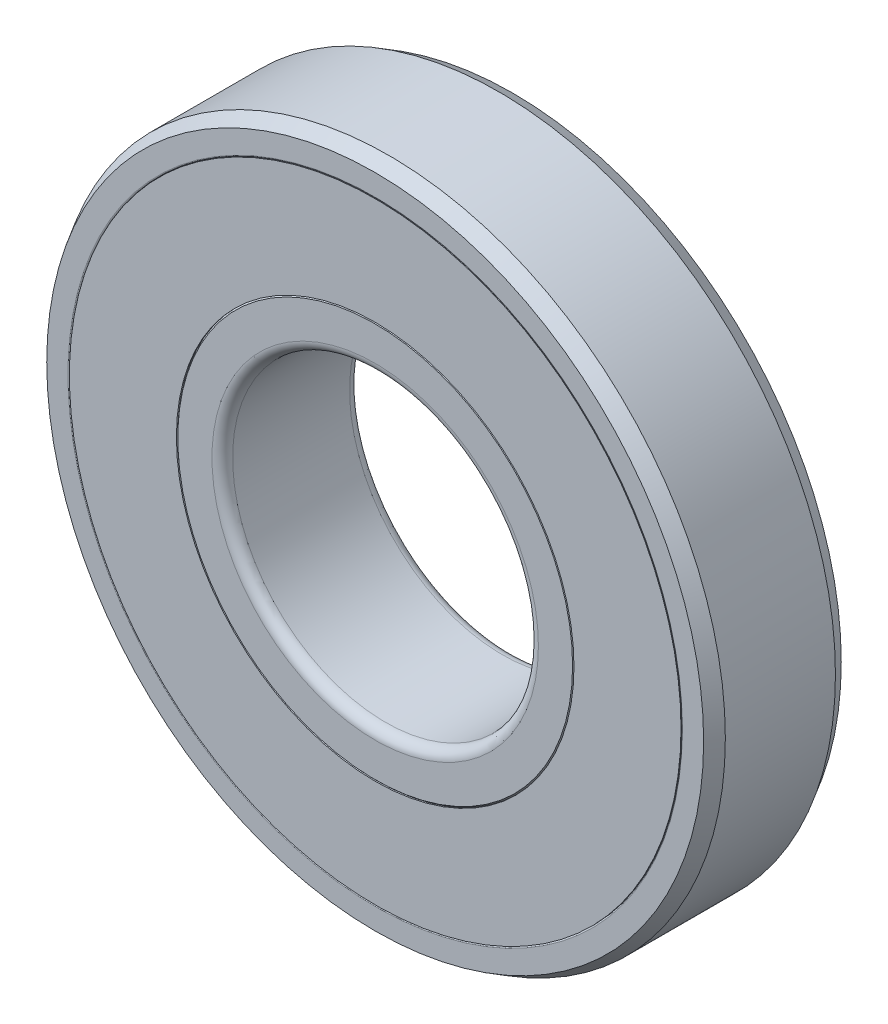
ISO-10303-21;
HEADER;
FILE_DESCRIPTION(('STEP AP214'),'2;1');
FILE_NAME('part.step','',(''),(''),'','','');
FILE_SCHEMA(('AUTOMOTIVE_DESIGN { 1 0 10303 214 1 1 1 1 }'));
ENDSEC;
DATA;
#1=APPLICATION_CONTEXT('core data for automotive mechanical design processes');
#2=APPLICATION_PROTOCOL_DEFINITION('international standard','automotive_design',2000,#1);
#3=PRODUCT_CONTEXT('',#1,'mechanical');
#4=PRODUCT('Part','Part','',(#3));
#5=PRODUCT_RELATED_PRODUCT_CATEGORY('part','',(#4));
#6=PRODUCT_DEFINITION_FORMATION('','',#4);
#7=PRODUCT_DEFINITION_CONTEXT('part definition',#1,'design');
#8=PRODUCT_DEFINITION('design','',#6,#7);
#9=PRODUCT_DEFINITION_SHAPE('','',#8);
#10=(LENGTH_UNIT() NAMED_UNIT(*) SI_UNIT(.MILLI.,.METRE.));
#11=(NAMED_UNIT(*) PLANE_ANGLE_UNIT() SI_UNIT($,.RADIAN.));
#12=(NAMED_UNIT(*) SI_UNIT($,.STERADIAN.) SOLID_ANGLE_UNIT());
#13=UNCERTAINTY_MEASURE_WITH_UNIT(LENGTH_MEASURE(1.E-05),#10,'distance_accuracy_value','');
#14=(GEOMETRIC_REPRESENTATION_CONTEXT(3) GLOBAL_UNCERTAINTY_ASSIGNED_CONTEXT((#13)) GLOBAL_UNIT_ASSIGNED_CONTEXT((#10,
#11,#12)) REPRESENTATION_CONTEXT('',''));
#15=CARTESIAN_POINT('',(0.,0.,0.));
#16=DIRECTION('',(0.,0.,1.));
#17=DIRECTION('',(1.,0.,0.));
#18=AXIS2_PLACEMENT_3D('',#15,#16,#17);
#19=CARTESIAN_POINT('',(10.2395491969484,-8.16576799871873,0.));
#20=DIRECTION('',(-0.781831482468022,0.623489801858743,0.));
#21=DIRECTION('',(0.,0.,1.));
#22=AXIS2_PLACEMENT_3D('',#19,#20,#21);
#23=SPHERICAL_SURFACE('',#22,3.2146875);
#24=CARTESIAN_POINT('',(7.72620530315196,-6.16144312630595,0.));
#25=VERTEX_POINT('',#24);
#26=VERTEX_LOOP('',#25);
#27=FACE_BOUND('',#26,.T.);
#28=ADVANCED_FACE('F42',(#27),#23,.T.);
#29=CLOSED_SHELL('',(#28));
#30=MANIFOLD_SOLID_BREP('B2',#29);
#31=CARTESIAN_POINT('',(12.7685089998563,2.91432885690898,0.));
#32=DIRECTION('',(-0.974927912181826,-0.222520933956305,0.));
#33=DIRECTION('',(0.,0.,1.));
#34=AXIS2_PLACEMENT_3D('',#31,#32,#33);
#35=SPHERICAL_SURFACE('',#34,3.2146875);
#36=CARTESIAN_POINT('',(9.63442042716434,2.19899359203132,0.));
#37=VERTEX_POINT('',#36);
#38=VERTEX_LOOP('',#37);
#39=FACE_BOUND('',#38,.T.);
#40=ADVANCED_FACE('F59',(#39),#35,.T.);
#41=CLOSED_SHELL('',(#40));
#42=MANIFOLD_SOLID_BREP('B6',#41);
#43=CARTESIAN_POINT('',(5.68252109575536,11.7998766418095,0.));
#44=DIRECTION('',(-0.433883739117565,-0.900968867902416,0.));
#45=DIRECTION('',(0.,0.,1.));
#46=AXIS2_PLACEMENT_3D('',#43,#44,#45);
#47=SPHERICAL_SURFACE('',#46,3.2146875);
#48=CARTESIAN_POINT('',(4.28772046316086,8.9035432842744,0.));
#49=VERTEX_POINT('',#48);
#50=VERTEX_LOOP('',#49);
#51=FACE_BOUND('',#50,.T.);
#52=ADVANCED_FACE('F76',(#51),#47,.T.);
#53=CLOSED_SHELL('',(#52));
#54=MANIFOLD_SOLID_BREP('B38',#53);
#55=CARTESIAN_POINT('',(-5.6825210957552,11.7998766418095,0.));
#56=DIRECTION('',(0.433883739117553,-0.900968867902422,0.));
#57=DIRECTION('',(0.,0.,1.));
#58=AXIS2_PLACEMENT_3D('',#55,#56,#57);
#59=SPHERICAL_SURFACE('',#58,3.2146875);
#60=CARTESIAN_POINT('',(-4.28772046316074,8.90354328427446,0.));
#61=VERTEX_POINT('',#60);
#62=VERTEX_LOOP('',#61);
#63=FACE_BOUND('',#62,.T.);
#64=ADVANCED_FACE('F93',(#63),#59,.T.);
#65=CLOSED_SHELL('',(#64));
#66=MANIFOLD_SOLID_BREP('B55',#65);
#67=CARTESIAN_POINT('',(-12.7685089998563,2.91432885690916,0.));
#68=DIRECTION('',(0.974927912181823,-0.222520933956318,0.));
#69=DIRECTION('',(0.,0.,1.));
#70=AXIS2_PLACEMENT_3D('',#67,#68,#69);
#71=SPHERICAL_SURFACE('',#70,3.2146875);
#72=CARTESIAN_POINT('',(-9.63442042716431,2.19899359203145,0.));
#73=VERTEX_POINT('',#72);
#74=VERTEX_LOOP('',#73);
#75=FACE_BOUND('',#74,.T.);
#76=ADVANCED_FACE('F110',(#75),#71,.T.);
#77=CLOSED_SHELL('',(#76));
#78=MANIFOLD_SOLID_BREP('B72',#77);
#79=CARTESIAN_POINT('',(-10.2395491969485,-8.16576799871858,0.));
#80=DIRECTION('',(0.781831482468031,0.623489801858732,0.));
#81=DIRECTION('',(0.,0.,1.));
#82=AXIS2_PLACEMENT_3D('',#79,#80,#81);
#83=SPHERICAL_SURFACE('',#82,3.2146875);
#84=CARTESIAN_POINT('',(-7.72620530315205,-6.16144312630584,0.));
#85=VERTEX_POINT('',#84);
#86=VERTEX_LOOP('',#85);
#87=FACE_BOUND('',#86,.T.);
#88=ADVANCED_FACE('F127',(#87),#83,.T.);
#89=CLOSED_SHELL('',(#88));
#90=MANIFOLD_SOLID_BREP('B89',#89);
#91=CARTESIAN_POINT('',(0.,-13.096875,0.));
#92=DIRECTION('',(0.,1.,0.));
#93=DIRECTION('',(0.,0.,1.));
#94=AXIS2_PLACEMENT_3D('',#91,#92,#93);
#95=SPHERICAL_SURFACE('',#94,3.2146875);
#96=CARTESIAN_POINT('',(0.,-9.8821875,0.));
#97=VERTEX_POINT('',#96);
#98=VERTEX_LOOP('',#97);
#99=FACE_BOUND('',#98,.T.);
#100=ADVANCED_FACE('F146',(#99),#95,.T.);
#101=CLOSED_SHELL('',(#100));
#102=MANIFOLD_SOLID_BREP('B106',#101);
#103=CARTESIAN_POINT('',(0.,-10.31875,3.571875));
#104=DIRECTION('',(0.,0.,1.));
#105=DIRECTION('',(1.,0.,0.));
#106=AXIS2_PLACEMENT_3D('',#103,#104,#105);
#107=PLANE('',#106);
#108=CARTESIAN_POINT('',(0.,0.,3.571875));
#109=DIRECTION('',(0.,0.,1.));
#110=DIRECTION('',(1.,0.,0.));
#111=AXIS2_PLACEMENT_3D('',#108,#109,#110);
#112=CIRCLE('',#111,15.875);
#113=CARTESIAN_POINT('',(15.875,0.,3.571875));
#114=VERTEX_POINT('',#113);
#115=EDGE_CURVE('E145',#114,#114,#112,.T.);
#116=ORIENTED_EDGE('',*,*,#115,.T.);
#117=EDGE_LOOP('',(#116));
#118=FACE_BOUND('',#117,.T.);
#119=CARTESIAN_POINT('',(0.,0.,3.571875));
#120=DIRECTION('',(0.,0.,1.));
#121=DIRECTION('',(1.,0.,0.));
#122=AXIS2_PLACEMENT_3D('',#119,#120,#121);
#123=CIRCLE('',#122,10.31875);
#124=CARTESIAN_POINT('',(10.31875,0.,3.571875));
#125=VERTEX_POINT('',#124);
#126=EDGE_CURVE('E179',#125,#125,#123,.T.);
#127=ORIENTED_EDGE('',*,*,#126,.F.);
#128=EDGE_LOOP('',(#127));
#129=FACE_BOUND('',#128,.T.);
#130=ADVANCED_FACE('F165',(#118,#129),#107,.T.);
#131=CARTESIAN_POINT('',(0.,0.,3.571875));
#132=DIRECTION('',(0.,0.,1.));
#133=DIRECTION('',(1.,0.,0.));
#134=AXIS2_PLACEMENT_3D('',#131,#132,#133);
#135=CYLINDRICAL_SURFACE('',#134,15.875);
#136=CARTESIAN_POINT('',(0.,0.,3.2146875));
#137=DIRECTION('',(0.,0.,1.));
#138=DIRECTION('',(1.,0.,0.));
#139=AXIS2_PLACEMENT_3D('',#136,#137,#138);
#140=CIRCLE('',#139,15.875);
#141=CARTESIAN_POINT('',(15.875,0.,3.2146875));
#142=VERTEX_POINT('',#141);
#143=EDGE_CURVE('E171',#142,#142,#140,.T.);
#144=ORIENTED_EDGE('',*,*,#143,.T.);
#145=EDGE_LOOP('',(#144));
#146=FACE_BOUND('',#145,.T.);
#147=ORIENTED_EDGE('',*,*,#115,.F.);
#148=EDGE_LOOP('',(#147));
#149=FACE_BOUND('',#148,.T.);
#150=ADVANCED_FACE('F189',(#146,#149),#135,.T.);
#151=CARTESIAN_POINT('',(0.,-10.31875,3.2146875));
#152=DIRECTION('',(0.,0.,-1.));
#153=DIRECTION('',(-1.,0.,0.));
#154=AXIS2_PLACEMENT_3D('',#151,#152,#153);
#155=PLANE('',#154);
#156=CARTESIAN_POINT('',(0.,0.,3.2146875));
#157=DIRECTION('',(0.,0.,1.));
#158=DIRECTION('',(1.,0.,0.));
#159=AXIS2_PLACEMENT_3D('',#156,#157,#158);
#160=CIRCLE('',#159,10.31875);
#161=CARTESIAN_POINT('',(10.31875,0.,3.2146875));
#162=VERTEX_POINT('',#161);
#163=EDGE_CURVE('E175',#162,#162,#160,.T.);
#164=ORIENTED_EDGE('',*,*,#163,.T.);
#165=EDGE_LOOP('',(#164));
#166=FACE_BOUND('',#165,.T.);
#167=ORIENTED_EDGE('',*,*,#143,.F.);
#168=EDGE_LOOP('',(#167));
#169=FACE_BOUND('',#168,.T.);
#170=ADVANCED_FACE('F193',(#166,#169),#155,.T.);
#171=CARTESIAN_POINT('',(0.,0.,3.571875));
#172=DIRECTION('',(0.,0.,1.));
#173=DIRECTION('',(1.,0.,0.));
#174=AXIS2_PLACEMENT_3D('',#171,#172,#173);
#175=CYLINDRICAL_SURFACE('',#174,10.31875);
#176=ORIENTED_EDGE('',*,*,#126,.T.);
#177=EDGE_LOOP('',(#176));
#178=FACE_BOUND('',#177,.T.);
#179=ORIENTED_EDGE('',*,*,#163,.F.);
#180=EDGE_LOOP('',(#179));
#181=FACE_BOUND('',#180,.T.);
#182=ADVANCED_FACE('F185',(#178,#181),#175,.F.);
#183=CLOSED_SHELL('',(#130,#150,#170,#182));
#184=MANIFOLD_SOLID_BREP('B123',#183);
#185=CARTESIAN_POINT('',(0.,0.,3.03609375));
#186=DIRECTION('',(0.,0.,1.));
#187=DIRECTION('',(1.,0.,0.));
#188=AXIS2_PLACEMENT_3D('',#185,#186,#187);
#189=TOROIDAL_SURFACE('',#188,8.47328125,0.535781249999999);
#190=CARTESIAN_POINT('',(0.,0.,3.571875));
#191=DIRECTION('',(0.,0.,1.));
#192=DIRECTION('',(1.,0.,0.));
#193=AXIS2_PLACEMENT_3D('',#190,#191,#192);
#194=CIRCLE('',#193,8.47328125);
#195=CARTESIAN_POINT('',(8.47328125,0.,3.571875));
#196=VERTEX_POINT('',#195);
#197=EDGE_CURVE('E164',#196,#196,#194,.T.);
#198=ORIENTED_EDGE('',*,*,#197,.T.);
#199=EDGE_LOOP('',(#198));
#200=FACE_BOUND('',#199,.T.);
#201=CARTESIAN_POINT('',(0.,0.,3.03609375));
#202=DIRECTION('',(0.,0.,1.));
#203=DIRECTION('',(1.,0.,0.));
#204=AXIS2_PLACEMENT_3D('',#201,#202,#203);
#205=CIRCLE('',#204,7.9375);
#206=CARTESIAN_POINT('',(7.9375,0.,3.03609375));
#207=VERTEX_POINT('',#206);
#208=EDGE_CURVE('E260',#207,#207,#205,.T.);
#209=ORIENTED_EDGE('',*,*,#208,.F.);
#210=EDGE_LOOP('',(#209));
#211=FACE_BOUND('',#210,.T.);
#212=ADVANCED_FACE('F226',(#200,#211),#189,.T.);
#213=CARTESIAN_POINT('',(0.,-10.2473125,3.571875));
#214=DIRECTION('',(0.,0.,1.));
#215=DIRECTION('',(1.,0.,0.));
#216=AXIS2_PLACEMENT_3D('',#213,#214,#215);
#217=PLANE('',#216);
#218=CARTESIAN_POINT('',(0.,0.,3.571875));
#219=DIRECTION('',(0.,0.,1.));
#220=DIRECTION('',(1.,0.,0.));
#221=AXIS2_PLACEMENT_3D('',#218,#219,#220);
#222=CIRCLE('',#221,10.2473125);
#223=CARTESIAN_POINT('',(10.2473125,0.,3.571875));
#224=VERTEX_POINT('',#223);
#225=EDGE_CURVE('E232',#224,#224,#222,.T.);
#226=ORIENTED_EDGE('',*,*,#225,.T.);
#227=EDGE_LOOP('',(#226));
#228=FACE_BOUND('',#227,.T.);
#229=ORIENTED_EDGE('',*,*,#197,.F.);
#230=EDGE_LOOP('',(#229));
#231=FACE_BOUND('',#230,.T.);
#232=ADVANCED_FACE('F268',(#228,#231),#217,.T.);
#233=CARTESIAN_POINT('',(0.,0.,3.571875));
#234=DIRECTION('',(0.,0.,-1.));
#235=DIRECTION('',(-1.,0.,0.));
#236=AXIS2_PLACEMENT_3D('',#233,#234,#235);
#237=CONICAL_SURFACE('',#236,10.2473125,0.78539816339746);
#238=CARTESIAN_POINT('',(0.,0.,3.5004375));
#239=DIRECTION('',(0.,0.,1.));
#240=DIRECTION('',(1.,0.,0.));
#241=AXIS2_PLACEMENT_3D('',#238,#239,#240);
#242=CIRCLE('',#241,10.31875);
#243=CARTESIAN_POINT('',(10.31875,0.,3.5004375));
#244=VERTEX_POINT('',#243);
#245=EDGE_CURVE('E236',#244,#244,#242,.T.);
#246=ORIENTED_EDGE('',*,*,#245,.T.);
#247=EDGE_LOOP('',(#246));
#248=FACE_BOUND('',#247,.T.);
#249=ORIENTED_EDGE('',*,*,#225,.F.);
#250=EDGE_LOOP('',(#249));
#251=FACE_BOUND('',#250,.T.);
#252=ADVANCED_FACE('F272',(#248,#251),#237,.T.);
#253=CARTESIAN_POINT('',(0.,0.,3.571875));
#254=DIRECTION('',(0.,0.,1.));
#255=DIRECTION('',(1.,0.,0.));
#256=AXIS2_PLACEMENT_3D('',#253,#254,#255);
#257=CYLINDRICAL_SURFACE('',#256,10.31875);
#258=CARTESIAN_POINT('',(0.,0.,1.61747865736499));
#259=DIRECTION('',(0.,0.,1.));
#260=DIRECTION('',(1.,0.,0.));
#261=AXIS2_PLACEMENT_3D('',#258,#259,#260);
#262=CIRCLE('',#261,10.31875);
#263=CARTESIAN_POINT('',(10.31875,0.,1.61747865736499));
#264=VERTEX_POINT('',#263);
#265=EDGE_CURVE('E240',#264,#264,#262,.T.);
#266=ORIENTED_EDGE('',*,*,#265,.T.);
#267=EDGE_LOOP('',(#266));
#268=FACE_BOUND('',#267,.T.);
#269=ORIENTED_EDGE('',*,*,#245,.F.);
#270=EDGE_LOOP('',(#269));
#271=FACE_BOUND('',#270,.T.);
#272=ADVANCED_FACE('F276',(#268,#271),#257,.T.);
#273=CARTESIAN_POINT('',(0.,0.,0.));
#274=DIRECTION('',(0.,0.,1.));
#275=DIRECTION('',(1.,0.,0.));
#276=AXIS2_PLACEMENT_3D('',#273,#274,#275);
#277=TOROIDAL_SURFACE('',#276,13.096875,3.2146875);
#278=CARTESIAN_POINT('',(0.,0.,-1.617478657365));
#279=DIRECTION('',(0.,0.,1.));
#280=DIRECTION('',(1.,0.,0.));
#281=AXIS2_PLACEMENT_3D('',#278,#279,#280);
#282=CIRCLE('',#281,10.31875);
#283=CARTESIAN_POINT('',(10.31875,0.,-1.617478657365));
#284=VERTEX_POINT('',#283);
#285=EDGE_CURVE('E245',#284,#284,#282,.T.);
#286=ORIENTED_EDGE('',*,*,#285,.T.);
#287=EDGE_LOOP('',(#286));
#288=FACE_BOUND('',#287,.T.);
#289=ORIENTED_EDGE('',*,*,#265,.F.);
#290=EDGE_LOOP('',(#289));
#291=FACE_BOUND('',#290,.T.);
#292=ADVANCED_FACE('F283',(#288,#291),#277,.F.);
#293=CARTESIAN_POINT('',(0.,0.,3.571875));
#294=DIRECTION('',(0.,0.,1.));
#295=DIRECTION('',(1.,0.,0.));
#296=AXIS2_PLACEMENT_3D('',#293,#294,#295);
#297=CYLINDRICAL_SURFACE('',#296,10.31875);
#298=CARTESIAN_POINT('',(0.,0.,-3.5004375));
#299=DIRECTION('',(0.,0.,1.));
#300=DIRECTION('',(1.,0.,0.));
#301=AXIS2_PLACEMENT_3D('',#298,#299,#300);
#302=CIRCLE('',#301,10.31875);
#303=CARTESIAN_POINT('',(10.31875,0.,-3.5004375));
#304=VERTEX_POINT('',#303);
#305=EDGE_CURVE('E248',#304,#304,#302,.T.);
#306=ORIENTED_EDGE('',*,*,#305,.T.);
#307=EDGE_LOOP('',(#306));
#308=FACE_BOUND('',#307,.T.);
#309=ORIENTED_EDGE('',*,*,#285,.F.);
#310=EDGE_LOOP('',(#309));
#311=FACE_BOUND('',#310,.T.);
#312=ADVANCED_FACE('F287',(#308,#311),#297,.T.);
#313=CARTESIAN_POINT('',(0.,0.,-3.5004375));
#314=DIRECTION('',(0.,0.,1.));
#315=DIRECTION('',(1.,0.,0.));
#316=AXIS2_PLACEMENT_3D('',#313,#314,#315);
#317=CONICAL_SURFACE('',#316,10.31875,0.785398163397473);
#318=CARTESIAN_POINT('',(0.,0.,-3.571875));
#319=DIRECTION('',(0.,0.,1.));
#320=DIRECTION('',(1.,0.,0.));
#321=AXIS2_PLACEMENT_3D('',#318,#319,#320);
#322=CIRCLE('',#321,10.2473125);
#323=CARTESIAN_POINT('',(10.2473125,0.,-3.571875));
#324=VERTEX_POINT('',#323);
#325=EDGE_CURVE('E251',#324,#324,#322,.T.);
#326=ORIENTED_EDGE('',*,*,#325,.T.);
#327=EDGE_LOOP('',(#326));
#328=FACE_BOUND('',#327,.T.);
#329=ORIENTED_EDGE('',*,*,#305,.F.);
#330=EDGE_LOOP('',(#329));
#331=FACE_BOUND('',#330,.T.);
#332=ADVANCED_FACE('F291',(#328,#331),#317,.T.);
#333=CARTESIAN_POINT('',(0.,-10.2473125,-3.571875));
#334=DIRECTION('',(0.,0.,-1.));
#335=DIRECTION('',(-1.,0.,0.));
#336=AXIS2_PLACEMENT_3D('',#333,#334,#335);
#337=PLANE('',#336);
#338=CARTESIAN_POINT('',(0.,0.,-3.571875));
#339=DIRECTION('',(0.,0.,1.));
#340=DIRECTION('',(1.,0.,0.));
#341=AXIS2_PLACEMENT_3D('',#338,#339,#340);
#342=CIRCLE('',#341,8.47328125);
#343=CARTESIAN_POINT('',(8.47328125,0.,-3.571875));
#344=VERTEX_POINT('',#343);
#345=EDGE_CURVE('E254',#344,#344,#342,.T.);
#346=ORIENTED_EDGE('',*,*,#345,.T.);
#347=EDGE_LOOP('',(#346));
#348=FACE_BOUND('',#347,.T.);
#349=ORIENTED_EDGE('',*,*,#325,.F.);
#350=EDGE_LOOP('',(#349));
#351=FACE_BOUND('',#350,.T.);
#352=ADVANCED_FACE('F295',(#348,#351),#337,.T.);
#353=CARTESIAN_POINT('',(0.,0.,-3.03609375));
#354=DIRECTION('',(0.,0.,1.));
#355=DIRECTION('',(1.,0.,0.));
#356=AXIS2_PLACEMENT_3D('',#353,#354,#355);
#357=TOROIDAL_SURFACE('',#356,8.47328125,0.535781249999999);
#358=CARTESIAN_POINT('',(0.,0.,-3.03609375));
#359=DIRECTION('',(0.,0.,1.));
#360=DIRECTION('',(1.,0.,0.));
#361=AXIS2_PLACEMENT_3D('',#358,#359,#360);
#362=CIRCLE('',#361,7.9375);
#363=CARTESIAN_POINT('',(7.9375,0.,-3.03609375));
#364=VERTEX_POINT('',#363);
#365=EDGE_CURVE('E257',#364,#364,#362,.T.);
#366=ORIENTED_EDGE('',*,*,#365,.T.);
#367=EDGE_LOOP('',(#366));
#368=FACE_BOUND('',#367,.T.);
#369=ORIENTED_EDGE('',*,*,#345,.F.);
#370=EDGE_LOOP('',(#369));
#371=FACE_BOUND('',#370,.T.);
#372=ADVANCED_FACE('F299',(#368,#371),#357,.T.);
#373=CARTESIAN_POINT('',(0.,0.,3.571875));
#374=DIRECTION('',(0.,0.,1.));
#375=DIRECTION('',(1.,0.,0.));
#376=AXIS2_PLACEMENT_3D('',#373,#374,#375);
#377=CYLINDRICAL_SURFACE('',#376,7.9375);
#378=ORIENTED_EDGE('',*,*,#208,.T.);
#379=EDGE_LOOP('',(#378));
#380=FACE_BOUND('',#379,.T.);
#381=ORIENTED_EDGE('',*,*,#365,.F.);
#382=EDGE_LOOP('',(#381));
#383=FACE_BOUND('',#382,.T.);
#384=ADVANCED_FACE('F264',(#380,#383),#377,.F.);
#385=CLOSED_SHELL('',(#212,#232,#252,#272,#292,#312,#332,#352,#372,#384));
#386=MANIFOLD_SOLID_BREP('B140',#385);
#387=CARTESIAN_POINT('',(0.,0.,3.571875));
#388=DIRECTION('',(0.,0.,-1.));
#389=DIRECTION('',(-1.,0.,0.));
#390=AXIS2_PLACEMENT_3D('',#387,#388,#389);
#391=CONICAL_SURFACE('',#390,17.0500554014477,0.523598775598293);
#392=CARTESIAN_POINT('',(0.,0.,2.8575));
#393=DIRECTION('',(0.,0.,1.));
#394=DIRECTION('',(1.,0.,0.));
#395=AXIS2_PLACEMENT_3D('',#392,#393,#394);
#396=CIRCLE('',#395,17.4625);
#397=CARTESIAN_POINT('',(17.4625,0.,2.8575));
#398=VERTEX_POINT('',#397);
#399=EDGE_CURVE('E225',#398,#398,#396,.T.);
#400=ORIENTED_EDGE('',*,*,#399,.T.);
#401=EDGE_LOOP('',(#400));
#402=FACE_BOUND('',#401,.T.);
#403=CARTESIAN_POINT('',(0.,0.,3.571875));
#404=DIRECTION('',(0.,0.,1.));
#405=DIRECTION('',(1.,0.,0.));
#406=AXIS2_PLACEMENT_3D('',#403,#404,#405);
#407=CIRCLE('',#406,17.0500554014477);
#408=CARTESIAN_POINT('',(17.0500554014477,0.,3.571875));
#409=VERTEX_POINT('',#408);
#410=EDGE_CURVE('E392',#409,#409,#407,.T.);
#411=ORIENTED_EDGE('',*,*,#410,.F.);
#412=EDGE_LOOP('',(#411));
#413=FACE_BOUND('',#412,.T.);
#414=ADVANCED_FACE('F358',(#402,#413),#391,.T.);
#415=CARTESIAN_POINT('',(0.,0.,3.571875));
#416=DIRECTION('',(0.,0.,1.));
#417=DIRECTION('',(1.,0.,0.));
#418=AXIS2_PLACEMENT_3D('',#415,#416,#417);
#419=CYLINDRICAL_SURFACE('',#418,17.4625);
#420=CARTESIAN_POINT('',(0.,0.,-2.8575));
#421=DIRECTION('',(0.,0.,1.));
#422=DIRECTION('',(1.,0.,0.));
#423=AXIS2_PLACEMENT_3D('',#420,#421,#422);
#424=CIRCLE('',#423,17.4625);
#425=CARTESIAN_POINT('',(17.4625,0.,-2.8575));
#426=VERTEX_POINT('',#425);
#427=EDGE_CURVE('E364',#426,#426,#424,.T.);
#428=ORIENTED_EDGE('',*,*,#427,.T.);
#429=EDGE_LOOP('',(#428));
#430=FACE_BOUND('',#429,.T.);
#431=ORIENTED_EDGE('',*,*,#399,.F.);
#432=EDGE_LOOP('',(#431));
#433=FACE_BOUND('',#432,.T.);
#434=ADVANCED_FACE('F400',(#430,#433),#419,.T.);
#435=CARTESIAN_POINT('',(0.,0.,-2.8575));
#436=DIRECTION('',(0.,0.,1.));
#437=DIRECTION('',(1.,0.,0.));
#438=AXIS2_PLACEMENT_3D('',#435,#436,#437);
#439=CONICAL_SURFACE('',#438,17.4625,0.523598775598293);
#440=CARTESIAN_POINT('',(0.,0.,-3.571875));
#441=DIRECTION('',(0.,0.,1.));
#442=DIRECTION('',(1.,0.,0.));
#443=AXIS2_PLACEMENT_3D('',#440,#441,#442);
#444=CIRCLE('',#443,17.0500554014477);
#445=CARTESIAN_POINT('',(17.0500554014477,0.,-3.571875));
#446=VERTEX_POINT('',#445);
#447=EDGE_CURVE('E368',#446,#446,#444,.T.);
#448=ORIENTED_EDGE('',*,*,#447,.T.);
#449=EDGE_LOOP('',(#448));
#450=FACE_BOUND('',#449,.T.);
#451=ORIENTED_EDGE('',*,*,#427,.F.);
#452=EDGE_LOOP('',(#451));
#453=FACE_BOUND('',#452,.T.);
#454=ADVANCED_FACE('F404',(#450,#453),#439,.T.);
#455=CARTESIAN_POINT('',(0.,-15.9464375,-3.571875));
#456=DIRECTION('',(0.,0.,-1.));
#457=DIRECTION('',(-1.,0.,0.));
#458=AXIS2_PLACEMENT_3D('',#455,#456,#457);
#459=PLANE('',#458);
#460=CARTESIAN_POINT('',(0.,0.,-3.571875));
#461=DIRECTION('',(0.,0.,1.));
#462=DIRECTION('',(1.,0.,0.));
#463=AXIS2_PLACEMENT_3D('',#460,#461,#462);
#464=CIRCLE('',#463,15.9464375);
#465=CARTESIAN_POINT('',(15.9464375,0.,-3.571875));
#466=VERTEX_POINT('',#465);
#467=EDGE_CURVE('E372',#466,#466,#464,.T.);
#468=ORIENTED_EDGE('',*,*,#467,.T.);
#469=EDGE_LOOP('',(#468));
#470=FACE_BOUND('',#469,.T.);
#471=ORIENTED_EDGE('',*,*,#447,.F.);
#472=EDGE_LOOP('',(#471));
#473=FACE_BOUND('',#472,.T.);
#474=ADVANCED_FACE('F408',(#470,#473),#459,.T.);
#475=CARTESIAN_POINT('',(0.,0.,-3.5004375));
#476=DIRECTION('',(0.,0.,1.));
#477=DIRECTION('',(1.,0.,0.));
#478=AXIS2_PLACEMENT_3D('',#475,#476,#477);
#479=TOROIDAL_SURFACE('',#478,15.9464375,0.0714374999999999);
#480=CARTESIAN_POINT('',(0.,0.,-3.5004375));
#481=DIRECTION('',(0.,0.,1.));
#482=DIRECTION('',(1.,0.,0.));
#483=AXIS2_PLACEMENT_3D('',#480,#481,#482);
#484=CIRCLE('',#483,15.875);
#485=CARTESIAN_POINT('',(15.875,0.,-3.5004375));
#486=VERTEX_POINT('',#485);
#487=EDGE_CURVE('E377',#486,#486,#484,.T.);
#488=ORIENTED_EDGE('',*,*,#487,.T.);
#489=EDGE_LOOP('',(#488));
#490=FACE_BOUND('',#489,.T.);
#491=ORIENTED_EDGE('',*,*,#467,.F.);
#492=EDGE_LOOP('',(#491));
#493=FACE_BOUND('',#492,.T.);
#494=ADVANCED_FACE('F415',(#490,#493),#479,.T.);
#495=CARTESIAN_POINT('',(0.,0.,3.571875));
#496=DIRECTION('',(0.,0.,1.));
#497=DIRECTION('',(1.,0.,0.));
#498=AXIS2_PLACEMENT_3D('',#495,#496,#497);
#499=CYLINDRICAL_SURFACE('',#498,15.875);
#500=CARTESIAN_POINT('',(0.,0.,-1.617478657365));
#501=DIRECTION('',(0.,0.,1.));
#502=DIRECTION('',(1.,0.,0.));
#503=AXIS2_PLACEMENT_3D('',#500,#501,#502);
#504=CIRCLE('',#503,15.875);
#505=CARTESIAN_POINT('',(15.875,0.,-1.617478657365));
#506=VERTEX_POINT('',#505);
#507=EDGE_CURVE('E380',#506,#506,#504,.T.);
#508=ORIENTED_EDGE('',*,*,#507,.T.);
#509=EDGE_LOOP('',(#508));
#510=FACE_BOUND('',#509,.T.);
#511=ORIENTED_EDGE('',*,*,#487,.F.);
#512=EDGE_LOOP('',(#511));
#513=FACE_BOUND('',#512,.T.);
#514=ADVANCED_FACE('F419',(#510,#513),#499,.F.);
#515=CARTESIAN_POINT('',(0.,0.,0.));
#516=DIRECTION('',(0.,0.,1.));
#517=DIRECTION('',(1.,0.,0.));
#518=AXIS2_PLACEMENT_3D('',#515,#516,#517);
#519=TOROIDAL_SURFACE('',#518,13.096875,3.2146875);
#520=CARTESIAN_POINT('',(0.,0.,1.61747865736499));
#521=DIRECTION('',(0.,0.,1.));
#522=DIRECTION('',(1.,0.,0.));
#523=AXIS2_PLACEMENT_3D('',#520,#521,#522);
#524=CIRCLE('',#523,15.875);
#525=CARTESIAN_POINT('',(15.875,0.,1.61747865736499));
#526=VERTEX_POINT('',#525);
#527=EDGE_CURVE('E383',#526,#526,#524,.T.);
#528=ORIENTED_EDGE('',*,*,#527,.T.);
#529=EDGE_LOOP('',(#528));
#530=FACE_BOUND('',#529,.T.);
#531=ORIENTED_EDGE('',*,*,#507,.F.);
#532=EDGE_LOOP('',(#531));
#533=FACE_BOUND('',#532,.T.);
#534=ADVANCED_FACE('F423',(#530,#533),#519,.F.);
#535=CARTESIAN_POINT('',(0.,0.,3.571875));
#536=DIRECTION('',(0.,0.,1.));
#537=DIRECTION('',(1.,0.,0.));
#538=AXIS2_PLACEMENT_3D('',#535,#536,#537);
#539=CYLINDRICAL_SURFACE('',#538,15.875);
#540=CARTESIAN_POINT('',(0.,0.,3.5004375));
#541=DIRECTION('',(0.,0.,1.));
#542=DIRECTION('',(1.,0.,0.));
#543=AXIS2_PLACEMENT_3D('',#540,#541,#542);
#544=CIRCLE('',#543,15.875);
#545=CARTESIAN_POINT('',(15.875,0.,3.5004375));
#546=VERTEX_POINT('',#545);
#547=EDGE_CURVE('E386',#546,#546,#544,.T.);
#548=ORIENTED_EDGE('',*,*,#547,.T.);
#549=EDGE_LOOP('',(#548));
#550=FACE_BOUND('',#549,.T.);
#551=ORIENTED_EDGE('',*,*,#527,.F.);
#552=EDGE_LOOP('',(#551));
#553=FACE_BOUND('',#552,.T.);
#554=ADVANCED_FACE('F427',(#550,#553),#539,.F.);
#555=CARTESIAN_POINT('',(0.,0.,3.5004375));
#556=DIRECTION('',(0.,0.,1.));
#557=DIRECTION('',(1.,0.,0.));
#558=AXIS2_PLACEMENT_3D('',#555,#556,#557);
#559=TOROIDAL_SURFACE('',#558,15.9464375,0.0714374999999999);
#560=CARTESIAN_POINT('',(0.,0.,3.571875));
#561=DIRECTION('',(0.,0.,1.));
#562=DIRECTION('',(1.,0.,0.));
#563=AXIS2_PLACEMENT_3D('',#560,#561,#562);
#564=CIRCLE('',#563,15.9464375);
#565=CARTESIAN_POINT('',(15.9464375,0.,3.571875));
#566=VERTEX_POINT('',#565);
#567=EDGE_CURVE('E389',#566,#566,#564,.T.);
#568=ORIENTED_EDGE('',*,*,#567,.T.);
#569=EDGE_LOOP('',(#568));
#570=FACE_BOUND('',#569,.T.);
#571=ORIENTED_EDGE('',*,*,#547,.F.);
#572=EDGE_LOOP('',(#571));
#573=FACE_BOUND('',#572,.T.);
#574=ADVANCED_FACE('F431',(#570,#573),#559,.T.);
#575=CARTESIAN_POINT('',(0.,-15.9464375,3.571875));
#576=DIRECTION('',(0.,0.,1.));
#577=DIRECTION('',(1.,0.,0.));
#578=AXIS2_PLACEMENT_3D('',#575,#576,#577);
#579=PLANE('',#578);
#580=ORIENTED_EDGE('',*,*,#410,.T.);
#581=EDGE_LOOP('',(#580));
#582=FACE_BOUND('',#581,.T.);
#583=ORIENTED_EDGE('',*,*,#567,.F.);
#584=EDGE_LOOP('',(#583));
#585=FACE_BOUND('',#584,.T.);
#586=ADVANCED_FACE('F396',(#582,#585),#579,.T.);
#587=CLOSED_SHELL('',(#414,#434,#454,#474,#494,#514,#534,#554,#574,#586));
#588=MANIFOLD_SOLID_BREP('B159',#587);
#589=ADVANCED_BREP_SHAPE_REPRESENTATION('',(#18,#30,#42,#54,#66,#78,#90,#102,#184,#386,#588),#14);
#590=SHAPE_DEFINITION_REPRESENTATION(#9,#589);
ENDSEC;
END-ISO-10303-21;
